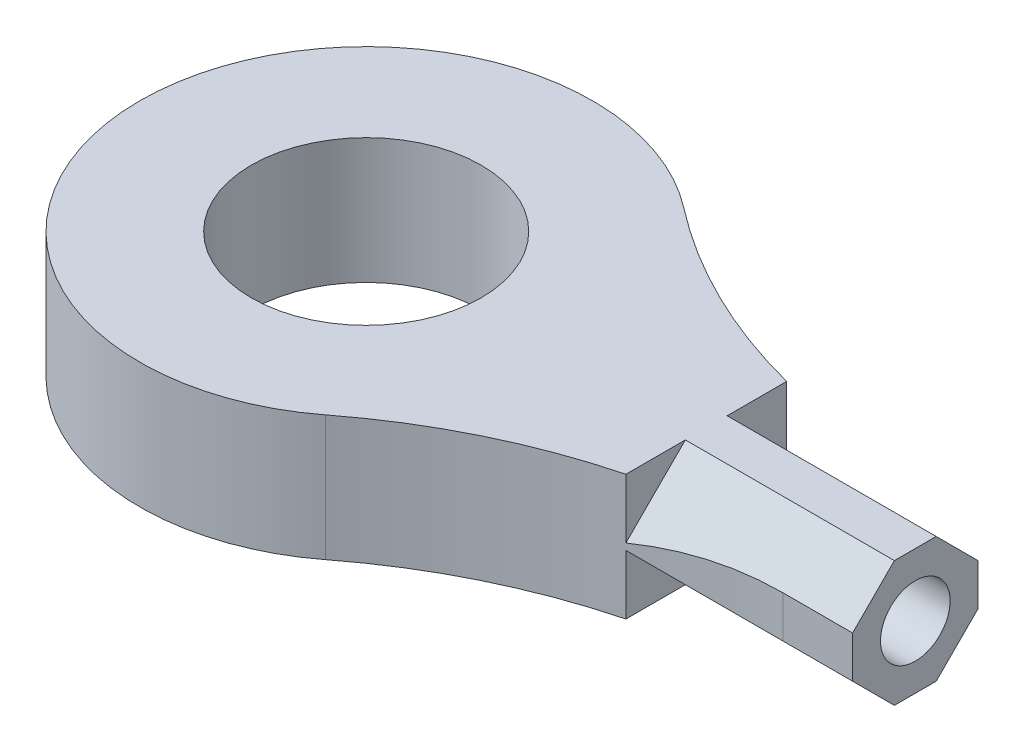
ISO-10303-21;
HEADER;
FILE_DESCRIPTION(('STEP AP214'),'2;1');
FILE_NAME('part.step','',(''),(''),'','','');
FILE_SCHEMA(('AUTOMOTIVE_DESIGN { 1 0 10303 214 1 1 1 1 }'));
ENDSEC;
DATA;
#1=APPLICATION_CONTEXT('core data for automotive mechanical design processes');
#2=APPLICATION_PROTOCOL_DEFINITION('international standard','automotive_design',2000,#1);
#3=PRODUCT_CONTEXT('',#1,'mechanical');
#4=PRODUCT('Part','Part','',(#3));
#5=PRODUCT_RELATED_PRODUCT_CATEGORY('part','',(#4));
#6=PRODUCT_DEFINITION_FORMATION('','',#4);
#7=PRODUCT_DEFINITION_CONTEXT('part definition',#1,'design');
#8=PRODUCT_DEFINITION('design','',#6,#7);
#9=PRODUCT_DEFINITION_SHAPE('','',#8);
#10=(LENGTH_UNIT() NAMED_UNIT(*) SI_UNIT(.MILLI.,.METRE.));
#11=(NAMED_UNIT(*) PLANE_ANGLE_UNIT() SI_UNIT($,.RADIAN.));
#12=(NAMED_UNIT(*) SI_UNIT($,.STERADIAN.) SOLID_ANGLE_UNIT());
#13=UNCERTAINTY_MEASURE_WITH_UNIT(LENGTH_MEASURE(1.E-05),#10,'distance_accuracy_value','');
#14=(GEOMETRIC_REPRESENTATION_CONTEXT(3) GLOBAL_UNCERTAINTY_ASSIGNED_CONTEXT((#13)) GLOBAL_UNIT_ASSIGNED_CONTEXT((#10,
#11,#12)) REPRESENTATION_CONTEXT('',''));
#15=CARTESIAN_POINT('',(0.,0.,0.));
#16=DIRECTION('',(0.,0.,1.));
#17=DIRECTION('',(1.,0.,0.));
#18=AXIS2_PLACEMENT_3D('',#15,#16,#17);
#19=CARTESIAN_POINT('',(34.4065764062628,9.,-44.5));
#20=DIRECTION('',(0.,1.,0.));
#21=DIRECTION('',(0.,0.,1.));
#22=AXIS2_PLACEMENT_3D('',#19,#20,#21);
#23=PLANE('',#22);
#24=DIRECTION('',(1.,0.,0.));
#25=VECTOR('',#24,1.);
#26=CARTESIAN_POINT('',(34.4065764062628,9.,-1.5));
#27=LINE('',#26,#25);
#28=CARTESIAN_POINT('',(24.4065764062628,9.,-1.5));
#29=VERTEX_POINT('',#28);
#30=CARTESIAN_POINT('',(39.4065764062628,9.,-1.5));
#31=VERTEX_POINT('',#30);
#32=EDGE_CURVE('E222',#29,#31,#27,.T.);
#33=ORIENTED_EDGE('',*,*,#32,.F.);
#34=DIRECTION('',(0.,0.,-1.));
#35=VECTOR('',#34,1.);
#36=CARTESIAN_POINT('',(24.4065764062628,9.,-44.5));
#37=LINE('',#36,#35);
#38=CARTESIAN_POINT('',(24.4065764062628,9.,-5.77016653792583));
#39=VERTEX_POINT('',#38);
#40=EDGE_CURVE('E210',#29,#39,#37,.T.);
#41=ORIENTED_EDGE('',*,*,#40,.T.);
#42=CARTESIAN_POINT('',(34.4065764062628,9.,-44.5));
#43=DIRECTION('',(0.,-1.,0.));
#44=DIRECTION('',(0.,0.,1.));
#45=AXIS2_PLACEMENT_3D('',#42,#43,#44);
#46=CIRCLE('',#45,40.);
#47=CARTESIAN_POINT('',(9.93967762847592,9.,-12.8555555555556));
#48=VERTEX_POINT('',#47);
#49=EDGE_CURVE('E219',#39,#48,#46,.T.);
#50=ORIENTED_EDGE('',*,*,#49,.T.);
#51=CARTESIAN_POINT('',(0.,9.,0.));
#52=DIRECTION('',(0.,1.,0.));
#53=DIRECTION('',(0.,0.,1.));
#54=AXIS2_PLACEMENT_3D('',#51,#52,#53);
#55=CIRCLE('',#54,16.25);
#56=CARTESIAN_POINT('',(9.93967762847592,9.,12.8555555555556));
#57=VERTEX_POINT('',#56);
#58=EDGE_CURVE('E226',#48,#57,#55,.T.);
#59=ORIENTED_EDGE('',*,*,#58,.T.);
#60=CARTESIAN_POINT('',(34.4065764062628,9.,44.5));
#61=DIRECTION('',(0.,-1.,0.));
#62=DIRECTION('',(0.,0.,-1.));
#63=AXIS2_PLACEMENT_3D('',#60,#61,#62);
#64=CIRCLE('',#63,40.);
#65=CARTESIAN_POINT('',(24.4065764062628,9.,5.77016653792583));
#66=VERTEX_POINT('',#65);
#67=EDGE_CURVE('E229',#57,#66,#64,.T.);
#68=ORIENTED_EDGE('',*,*,#67,.T.);
#69=DIRECTION('',(0.,0.,-1.));
#70=VECTOR('',#69,1.);
#71=CARTESIAN_POINT('',(24.4065764062628,9.,-44.5));
#72=LINE('',#71,#70);
#73=CARTESIAN_POINT('',(24.4065764062628,9.,1.5));
#74=VERTEX_POINT('',#73);
#75=EDGE_CURVE('E281',#66,#74,#72,.T.);
#76=ORIENTED_EDGE('',*,*,#75,.T.);
#77=DIRECTION('',(1.,0.,0.));
#78=VECTOR('',#77,1.);
#79=CARTESIAN_POINT('',(34.4065764062628,9.,1.49999999999999));
#80=LINE('',#79,#78);
#81=CARTESIAN_POINT('',(39.4065764062628,9.,1.5));
#82=VERTEX_POINT('',#81);
#83=EDGE_CURVE('E278',#74,#82,#80,.T.);
#84=ORIENTED_EDGE('',*,*,#83,.T.);
#85=DIRECTION('',(0.,0.,-1.));
#86=VECTOR('',#85,1.);
#87=CARTESIAN_POINT('',(39.4065764062628,9.,-4.5));
#88=LINE('',#87,#86);
#89=EDGE_CURVE('E239',#82,#31,#88,.T.);
#90=ORIENTED_EDGE('',*,*,#89,.T.);
#91=EDGE_LOOP('',(#33,#41,#50,#59,#68,#76,#84,#90));
#92=FACE_BOUND('',#91,.T.);
#93=CARTESIAN_POINT('',(0.,9.,0.));
#94=DIRECTION('',(0.,1.,0.));
#95=DIRECTION('',(0.,0.,1.));
#96=AXIS2_PLACEMENT_3D('',#93,#94,#95);
#97=CIRCLE('',#96,8.25);
#98=CARTESIAN_POINT('',(0.,9.,8.25));
#99=VERTEX_POINT('',#98);
#100=EDGE_CURVE('E244',#99,#99,#97,.T.);
#101=ORIENTED_EDGE('',*,*,#100,.F.);
#102=EDGE_LOOP('',(#101));
#103=FACE_BOUND('',#102,.T.);
#104=ADVANCED_FACE('F58',(#92,#103),#23,.T.);
#105=CARTESIAN_POINT('',(34.4065764062628,0.,-44.5));
#106=DIRECTION('',(0.,1.,0.));
#107=DIRECTION('',(0.,0.,1.));
#108=AXIS2_PLACEMENT_3D('',#105,#106,#107);
#109=PLANE('',#108);
#110=CARTESIAN_POINT('',(0.,0.,0.));
#111=DIRECTION('',(0.,1.,0.));
#112=DIRECTION('',(0.,0.,1.));
#113=AXIS2_PLACEMENT_3D('',#110,#111,#112);
#114=CIRCLE('',#113,8.25);
#115=CARTESIAN_POINT('',(0.,0.,8.25));
#116=VERTEX_POINT('',#115);
#117=EDGE_CURVE('E234',#116,#116,#114,.T.);
#118=ORIENTED_EDGE('',*,*,#117,.T.);
#119=EDGE_LOOP('',(#118));
#120=FACE_BOUND('',#119,.T.);
#121=DIRECTION('',(0.,0.,-1.));
#122=VECTOR('',#121,1.);
#123=CARTESIAN_POINT('',(39.4065764062628,0.,-4.5));
#124=LINE('',#123,#122);
#125=CARTESIAN_POINT('',(39.4065764062628,0.,1.5));
#126=VERTEX_POINT('',#125);
#127=CARTESIAN_POINT('',(39.4065764062628,0.,-1.5));
#128=VERTEX_POINT('',#127);
#129=EDGE_CURVE('E227',#126,#128,#124,.T.);
#130=ORIENTED_EDGE('',*,*,#129,.F.);
#131=DIRECTION('',(-1.,0.,0.));
#132=VECTOR('',#131,1.);
#133=CARTESIAN_POINT('',(34.4065764062628,0.,1.5));
#134=LINE('',#133,#132);
#135=CARTESIAN_POINT('',(24.4065764062628,0.,1.5));
#136=VERTEX_POINT('',#135);
#137=EDGE_CURVE('E73',#126,#136,#134,.T.);
#138=ORIENTED_EDGE('',*,*,#137,.T.);
#139=DIRECTION('',(0.,0.,-1.));
#140=VECTOR('',#139,1.);
#141=CARTESIAN_POINT('',(24.4065764062628,0.,-44.5));
#142=LINE('',#141,#140);
#143=CARTESIAN_POINT('',(24.4065764062628,0.,5.77016653792583));
#144=VERTEX_POINT('',#143);
#145=EDGE_CURVE('E339',#144,#136,#142,.T.);
#146=ORIENTED_EDGE('',*,*,#145,.F.);
#147=CARTESIAN_POINT('',(34.4065764062628,0.,44.5));
#148=DIRECTION('',(0.,-1.,0.));
#149=DIRECTION('',(0.,0.,-1.));
#150=AXIS2_PLACEMENT_3D('',#147,#148,#149);
#151=CIRCLE('',#150,40.);
#152=CARTESIAN_POINT('',(9.93967762847592,0.,12.8555555555556));
#153=VERTEX_POINT('',#152);
#154=EDGE_CURVE('E231',#153,#144,#151,.T.);
#155=ORIENTED_EDGE('',*,*,#154,.F.);
#156=CARTESIAN_POINT('',(0.,0.,0.));
#157=DIRECTION('',(0.,1.,0.));
#158=DIRECTION('',(0.,0.,1.));
#159=AXIS2_PLACEMENT_3D('',#156,#157,#158);
#160=CIRCLE('',#159,16.25);
#161=CARTESIAN_POINT('',(9.93967762847592,0.,-12.8555555555556));
#162=VERTEX_POINT('',#161);
#163=EDGE_CURVE('E243',#162,#153,#160,.T.);
#164=ORIENTED_EDGE('',*,*,#163,.F.);
#165=CARTESIAN_POINT('',(34.4065764062628,0.,-44.5));
#166=DIRECTION('',(0.,-1.,0.));
#167=DIRECTION('',(0.,0.,1.));
#168=AXIS2_PLACEMENT_3D('',#165,#166,#167);
#169=CIRCLE('',#168,40.);
#170=CARTESIAN_POINT('',(24.4065764062628,0.,-5.77016653792583));
#171=VERTEX_POINT('',#170);
#172=EDGE_CURVE('E241',#171,#162,#169,.T.);
#173=ORIENTED_EDGE('',*,*,#172,.F.);
#174=DIRECTION('',(0.,0.,-1.));
#175=VECTOR('',#174,1.);
#176=CARTESIAN_POINT('',(24.4065764062628,0.,-44.5));
#177=LINE('',#176,#175);
#178=CARTESIAN_POINT('',(24.4065764062628,0.,-1.5));
#179=VERTEX_POINT('',#178);
#180=EDGE_CURVE('E284',#179,#171,#177,.T.);
#181=ORIENTED_EDGE('',*,*,#180,.F.);
#182=DIRECTION('',(-1.,0.,0.));
#183=VECTOR('',#182,1.);
#184=CARTESIAN_POINT('',(34.4065764062628,0.,-1.5));
#185=LINE('',#184,#183);
#186=EDGE_CURVE('E262',#128,#179,#185,.T.);
#187=ORIENTED_EDGE('',*,*,#186,.F.);
#188=EDGE_LOOP('',(#130,#138,#146,#155,#164,#173,#181,#187));
#189=FACE_BOUND('',#188,.T.);
#190=ADVANCED_FACE('F297',(#120,#189),#109,.F.);
#191=CARTESIAN_POINT('',(34.4065764062628,9.,-44.5));
#192=DIRECTION('',(0.,-1.,0.));
#193=DIRECTION('',(0.,0.,-1.));
#194=AXIS2_PLACEMENT_3D('',#191,#192,#193);
#195=CYLINDRICAL_SURFACE('',#194,40.);
#196=DIRECTION('',(0.,-1.,0.));
#197=VECTOR('',#196,1.);
#198=CARTESIAN_POINT('',(24.4065764062628,9.,-5.77016653792583));
#199=LINE('',#198,#197);
#200=CARTESIAN_POINT('',(24.4065764062628,4.72983346207417,-5.77016653792583));
#201=VERTEX_POINT('',#200);
#202=EDGE_CURVE('E166',#201,#39,#199,.F.);
#203=ORIENTED_EDGE('',*,*,#202,.F.);
#204=CARTESIAN_POINT('',(34.4065764062628,-34.,-44.5));
#205=DIRECTION('',(0.,-0.707106781186548,0.707106781186547));
#206=DIRECTION('',(0.,-0.707106781186547,-0.707106781186548));
#207=AXIS2_PLACEMENT_3D('',#204,#205,#206);
#208=ELLIPSE('',#207,56.5685424949238,40.);
#209=CARTESIAN_POINT('',(34.4065764062628,6.,-4.5));
#210=VERTEX_POINT('',#209);
#211=EDGE_CURVE('E252',#201,#210,#208,.F.);
#212=ORIENTED_EDGE('',*,*,#211,.T.);
#213=DIRECTION('',(0.,-1.,0.));
#214=VECTOR('',#213,1.);
#215=CARTESIAN_POINT('',(34.4065764062628,9.,-4.5));
#216=LINE('',#215,#214);
#217=CARTESIAN_POINT('',(34.4065764062628,3.,-4.5));
#218=VERTEX_POINT('',#217);
#219=EDGE_CURVE('E186',#210,#218,#216,.T.);
#220=ORIENTED_EDGE('',*,*,#219,.T.);
#221=CARTESIAN_POINT('',(34.4065764062628,43.,-44.5));
#222=DIRECTION('',(0.,-0.707106781186547,-0.707106781186547));
#223=DIRECTION('',(0.,-0.707106781186548,0.707106781186548));
#224=AXIS2_PLACEMENT_3D('',#221,#222,#223);
#225=ELLIPSE('',#224,56.5685424949238,40.);
#226=CARTESIAN_POINT('',(24.4065764062628,4.27016653792583,-5.77016653792583));
#227=VERTEX_POINT('',#226);
#228=EDGE_CURVE('E251',#227,#218,#225,.F.);
#229=ORIENTED_EDGE('',*,*,#228,.F.);
#230=DIRECTION('',(0.,-1.,0.));
#231=VECTOR('',#230,1.);
#232=CARTESIAN_POINT('',(24.4065764062628,9.,-5.77016653792583));
#233=LINE('',#232,#231);
#234=EDGE_CURVE('E201',#171,#227,#233,.F.);
#235=ORIENTED_EDGE('',*,*,#234,.F.);
#236=ORIENTED_EDGE('',*,*,#172,.T.);
#237=DIRECTION('',(0.,-1.,0.));
#238=VECTOR('',#237,1.);
#239=CARTESIAN_POINT('',(9.93967762847592,9.,-12.8555555555556));
#240=LINE('',#239,#238);
#241=EDGE_CURVE('E192',#48,#162,#240,.T.);
#242=ORIENTED_EDGE('',*,*,#241,.F.);
#243=ORIENTED_EDGE('',*,*,#49,.F.);
#244=EDGE_LOOP('',(#203,#212,#220,#229,#235,#236,#242,#243));
#245=FACE_BOUND('',#244,.T.);
#246=ADVANCED_FACE('F60',(#245),#195,.F.);
#247=CARTESIAN_POINT('',(34.4065764062628,9.,44.5));
#248=DIRECTION('',(0.,-1.,0.));
#249=DIRECTION('',(0.,0.,-1.));
#250=AXIS2_PLACEMENT_3D('',#247,#248,#249);
#251=CYLINDRICAL_SURFACE('',#250,40.);
#252=DIRECTION('',(0.,-1.,0.));
#253=VECTOR('',#252,1.);
#254=CARTESIAN_POINT('',(24.4065764062628,9.,5.77016653792583));
#255=LINE('',#254,#253);
#256=CARTESIAN_POINT('',(24.4065764062628,4.27016653792583,5.77016653792583));
#257=VERTEX_POINT('',#256);
#258=EDGE_CURVE('E12',#257,#144,#255,.T.);
#259=ORIENTED_EDGE('',*,*,#258,.F.);
#260=CARTESIAN_POINT('',(34.4065764062628,43.,44.5));
#261=DIRECTION('',(0.,0.707106781186547,-0.707106781186547));
#262=DIRECTION('',(0.,-0.707106781186548,-0.707106781186548));
#263=AXIS2_PLACEMENT_3D('',#260,#261,#262);
#264=ELLIPSE('',#263,56.5685424949238,40.);
#265=CARTESIAN_POINT('',(34.4065764062628,3.,4.5));
#266=VERTEX_POINT('',#265);
#267=EDGE_CURVE('E175',#257,#266,#264,.F.);
#268=ORIENTED_EDGE('',*,*,#267,.T.);
#269=DIRECTION('',(0.,-1.,0.));
#270=VECTOR('',#269,1.);
#271=CARTESIAN_POINT('',(34.4065764062628,9.,4.5));
#272=LINE('',#271,#270);
#273=CARTESIAN_POINT('',(34.4065764062628,6.,4.5));
#274=VERTEX_POINT('',#273);
#275=EDGE_CURVE('E174',#274,#266,#272,.T.);
#276=ORIENTED_EDGE('',*,*,#275,.F.);
#277=CARTESIAN_POINT('',(34.4065764062628,-34.,44.5));
#278=DIRECTION('',(0.,0.707106781186548,0.707106781186547));
#279=DIRECTION('',(0.,-0.707106781186547,0.707106781186548));
#280=AXIS2_PLACEMENT_3D('',#277,#278,#279);
#281=ELLIPSE('',#280,56.5685424949238,40.);
#282=CARTESIAN_POINT('',(24.4065764062628,4.72983346207417,5.77016653792583));
#283=VERTEX_POINT('',#282);
#284=EDGE_CURVE('E276',#283,#274,#281,.F.);
#285=ORIENTED_EDGE('',*,*,#284,.F.);
#286=DIRECTION('',(0.,-1.,0.));
#287=VECTOR('',#286,1.);
#288=CARTESIAN_POINT('',(24.4065764062628,9.,5.77016653792583));
#289=LINE('',#288,#287);
#290=EDGE_CURVE('E199',#66,#283,#289,.T.);
#291=ORIENTED_EDGE('',*,*,#290,.F.);
#292=ORIENTED_EDGE('',*,*,#67,.F.);
#293=DIRECTION('',(0.,-1.,0.));
#294=VECTOR('',#293,1.);
#295=CARTESIAN_POINT('',(9.93967762847592,9.,12.8555555555556));
#296=LINE('',#295,#294);
#297=EDGE_CURVE('E184',#57,#153,#296,.T.);
#298=ORIENTED_EDGE('',*,*,#297,.T.);
#299=ORIENTED_EDGE('',*,*,#154,.T.);
#300=EDGE_LOOP('',(#259,#268,#276,#285,#291,#292,#298,#299));
#301=FACE_BOUND('',#300,.T.);
#302=ADVANCED_FACE('F327',(#301),#251,.F.);
#303=CARTESIAN_POINT('',(39.4065764062628,9.,4.5));
#304=DIRECTION('',(0.,0.,-1.));
#305=DIRECTION('',(-1.,0.,0.));
#306=AXIS2_PLACEMENT_3D('',#303,#304,#305);
#307=PLANE('',#306);
#308=ORIENTED_EDGE('',*,*,#275,.T.);
#309=DIRECTION('',(1.,0.,0.));
#310=VECTOR('',#309,1.);
#311=CARTESIAN_POINT('',(39.4065764062628,3.,4.5));
#312=LINE('',#311,#310);
#313=CARTESIAN_POINT('',(39.4065764062628,3.,4.5));
#314=VERTEX_POINT('',#313);
#315=EDGE_CURVE('E161',#266,#314,#312,.T.);
#316=ORIENTED_EDGE('',*,*,#315,.T.);
#317=DIRECTION('',(0.,-1.,0.));
#318=VECTOR('',#317,1.);
#319=CARTESIAN_POINT('',(39.4065764062628,9.,4.5));
#320=LINE('',#319,#318);
#321=CARTESIAN_POINT('',(39.4065764062628,6.,4.5));
#322=VERTEX_POINT('',#321);
#323=EDGE_CURVE('E172',#322,#314,#320,.T.);
#324=ORIENTED_EDGE('',*,*,#323,.F.);
#325=DIRECTION('',(1.,0.,0.));
#326=VECTOR('',#325,1.);
#327=CARTESIAN_POINT('',(39.4065764062628,6.,4.5));
#328=LINE('',#327,#326);
#329=EDGE_CURVE('E274',#274,#322,#328,.T.);
#330=ORIENTED_EDGE('',*,*,#329,.F.);
#331=EDGE_LOOP('',(#308,#316,#324,#330));
#332=FACE_BOUND('',#331,.T.);
#333=ADVANCED_FACE('F170',(#332),#307,.F.);
#334=CARTESIAN_POINT('',(39.4065764062628,9.,-4.5));
#335=DIRECTION('',(-1.,0.,0.));
#336=DIRECTION('',(0.,0.,1.));
#337=AXIS2_PLACEMENT_3D('',#334,#335,#336);
#338=PLANE('',#337);
#339=CARTESIAN_POINT('',(39.4065764062628,4.5,0.));
#340=DIRECTION('',(1.,0.,0.));
#341=DIRECTION('',(0.,0.,-1.));
#342=AXIS2_PLACEMENT_3D('',#339,#340,#341);
#343=CIRCLE('',#342,2.49999999999999);
#344=CARTESIAN_POINT('',(39.4065764062628,4.5,-2.49999999999999));
#345=VERTEX_POINT('',#344);
#346=EDGE_CURVE('E286',#345,#345,#343,.T.);
#347=ORIENTED_EDGE('',*,*,#346,.F.);
#348=EDGE_LOOP('',(#347));
#349=FACE_BOUND('',#348,.T.);
#350=ORIENTED_EDGE('',*,*,#323,.T.);
#351=DIRECTION('',(0.,-0.707106781186548,-0.707106781186548));
#352=VECTOR('',#351,1.);
#353=CARTESIAN_POINT('',(39.4065764062628,1.5,3.));
#354=LINE('',#353,#352);
#355=EDGE_CURVE('E66',#314,#126,#354,.T.);
#356=ORIENTED_EDGE('',*,*,#355,.T.);
#357=ORIENTED_EDGE('',*,*,#129,.T.);
#358=DIRECTION('',(0.,0.707106781186548,-0.707106781186548));
#359=VECTOR('',#358,1.);
#360=CARTESIAN_POINT('',(39.4065764062628,-0.75,-0.75));
#361=LINE('',#360,#359);
#362=CARTESIAN_POINT('',(39.4065764062628,3.,-4.5));
#363=VERTEX_POINT('',#362);
#364=EDGE_CURVE('E223',#128,#363,#361,.T.);
#365=ORIENTED_EDGE('',*,*,#364,.T.);
#366=DIRECTION('',(0.,-1.,0.));
#367=VECTOR('',#366,1.);
#368=CARTESIAN_POINT('',(39.4065764062628,9.,-4.5));
#369=LINE('',#368,#367);
#370=CARTESIAN_POINT('',(39.4065764062628,6.,-4.5));
#371=VERTEX_POINT('',#370);
#372=EDGE_CURVE('E182',#371,#363,#369,.T.);
#373=ORIENTED_EDGE('',*,*,#372,.F.);
#374=DIRECTION('',(0.,-0.707106781186547,-0.707106781186548));
#375=VECTOR('',#374,1.);
#376=CARTESIAN_POINT('',(39.4065764062628,5.25,-5.25));
#377=LINE('',#376,#375);
#378=EDGE_CURVE('E81',#31,#371,#377,.T.);
#379=ORIENTED_EDGE('',*,*,#378,.F.);
#380=ORIENTED_EDGE('',*,*,#89,.F.);
#381=DIRECTION('',(0.,0.707106781186547,-0.707106781186548));
#382=VECTOR('',#381,1.);
#383=CARTESIAN_POINT('',(39.4065764062628,12.,-1.5));
#384=LINE('',#383,#382);
#385=EDGE_CURVE('E181',#322,#82,#384,.T.);
#386=ORIENTED_EDGE('',*,*,#385,.F.);
#387=EDGE_LOOP('',(#350,#356,#357,#365,#373,#379,#380,#386));
#388=FACE_BOUND('',#387,.T.);
#389=ADVANCED_FACE('F179',(#349,#388),#338,.F.);
#390=CARTESIAN_POINT('',(39.4065764062628,9.,-4.5));
#391=DIRECTION('',(0.,0.,1.));
#392=DIRECTION('',(1.,0.,0.));
#393=AXIS2_PLACEMENT_3D('',#390,#391,#392);
#394=PLANE('',#393);
#395=ORIENTED_EDGE('',*,*,#219,.F.);
#396=DIRECTION('',(1.,0.,0.));
#397=VECTOR('',#396,1.);
#398=CARTESIAN_POINT('',(39.4065764062628,6.,-4.5));
#399=LINE('',#398,#397);
#400=EDGE_CURVE('E203',#210,#371,#399,.T.);
#401=ORIENTED_EDGE('',*,*,#400,.T.);
#402=ORIENTED_EDGE('',*,*,#372,.T.);
#403=DIRECTION('',(1.,0.,0.));
#404=VECTOR('',#403,1.);
#405=CARTESIAN_POINT('',(39.4065764062628,3.,-4.5));
#406=LINE('',#405,#404);
#407=EDGE_CURVE('E195',#218,#363,#406,.T.);
#408=ORIENTED_EDGE('',*,*,#407,.F.);
#409=EDGE_LOOP('',(#395,#401,#402,#408));
#410=FACE_BOUND('',#409,.T.);
#411=ADVANCED_FACE('F265',(#410),#394,.F.);
#412=CARTESIAN_POINT('',(0.,9.,0.));
#413=DIRECTION('',(0.,-1.,0.));
#414=DIRECTION('',(0.,0.,-1.));
#415=AXIS2_PLACEMENT_3D('',#412,#413,#414);
#416=CYLINDRICAL_SURFACE('',#415,16.25);
#417=ORIENTED_EDGE('',*,*,#163,.T.);
#418=ORIENTED_EDGE('',*,*,#297,.F.);
#419=ORIENTED_EDGE('',*,*,#58,.F.);
#420=ORIENTED_EDGE('',*,*,#241,.T.);
#421=EDGE_LOOP('',(#417,#418,#419,#420));
#422=FACE_BOUND('',#421,.T.);
#423=ADVANCED_FACE('F303',(#422),#416,.T.);
#424=CARTESIAN_POINT('',(0.,9.,0.));
#425=DIRECTION('',(0.,-1.,0.));
#426=DIRECTION('',(0.,0.,-1.));
#427=AXIS2_PLACEMENT_3D('',#424,#425,#426);
#428=CYLINDRICAL_SURFACE('',#427,8.25);
#429=ORIENTED_EDGE('',*,*,#100,.T.);
#430=EDGE_LOOP('',(#429));
#431=FACE_BOUND('',#430,.T.);
#432=ORIENTED_EDGE('',*,*,#117,.F.);
#433=EDGE_LOOP('',(#432));
#434=FACE_BOUND('',#433,.T.);
#435=ADVANCED_FACE('F300',(#431,#434),#428,.F.);
#436=CARTESIAN_POINT('',(24.4065764062628,4.5,0.));
#437=DIRECTION('',(1.,0.,0.));
#438=DIRECTION('',(0.,0.,-1.));
#439=AXIS2_PLACEMENT_3D('',#436,#437,#438);
#440=CONICAL_SURFACE('',#439,2.5,1.02974425867665);
#441=CARTESIAN_POINT('',(22.9044248586939,4.5,0.));
#442=VERTEX_POINT('',#441);
#443=VERTEX_LOOP('',#442);
#444=FACE_BOUND('',#443,.T.);
#445=CARTESIAN_POINT('',(24.4065764062628,4.5,0.));
#446=DIRECTION('',(1.,0.,0.));
#447=DIRECTION('',(0.,0.,-1.));
#448=AXIS2_PLACEMENT_3D('',#445,#446,#447);
#449=CIRCLE('',#448,2.5);
#450=CARTESIAN_POINT('',(24.4065764062628,4.5,-2.5));
#451=VERTEX_POINT('',#450);
#452=EDGE_CURVE('E289',#451,#451,#449,.T.);
#453=ORIENTED_EDGE('',*,*,#452,.T.);
#454=EDGE_LOOP('',(#453));
#455=FACE_BOUND('',#454,.T.);
#456=ADVANCED_FACE('F302',(#444,#455),#440,.F.);
#457=CARTESIAN_POINT('',(39.4065764062628,4.5,0.));
#458=DIRECTION('',(1.,0.,0.));
#459=DIRECTION('',(0.,0.,-1.));
#460=AXIS2_PLACEMENT_3D('',#457,#458,#459);
#461=CYLINDRICAL_SURFACE('',#460,2.49999999999999);
#462=ORIENTED_EDGE('',*,*,#452,.F.);
#463=EDGE_LOOP('',(#462));
#464=FACE_BOUND('',#463,.T.);
#465=ORIENTED_EDGE('',*,*,#346,.T.);
#466=EDGE_LOOP('',(#465));
#467=FACE_BOUND('',#466,.T.);
#468=ADVANCED_FACE('F309',(#464,#467),#461,.F.);
#469=CARTESIAN_POINT('',(24.4065764062628,0.,0.));
#470=DIRECTION('',(1.,0.,0.));
#471=DIRECTION('',(0.,0.,-1.));
#472=AXIS2_PLACEMENT_3D('',#469,#470,#471);
#473=PLANE('',#472);
#474=ORIENTED_EDGE('',*,*,#180,.T.);
#475=ORIENTED_EDGE('',*,*,#234,.T.);
#476=DIRECTION('',(0.,0.707106781186548,-0.707106781186548));
#477=VECTOR('',#476,1.);
#478=CARTESIAN_POINT('',(24.4065764062628,-0.75,-0.75));
#479=LINE('',#478,#477);
#480=EDGE_CURVE('E261',#179,#227,#479,.T.);
#481=ORIENTED_EDGE('',*,*,#480,.F.);
#482=EDGE_LOOP('',(#474,#475,#481));
#483=FACE_BOUND('',#482,.T.);
#484=ADVANCED_FACE('F362',(#483),#473,.T.);
#485=CARTESIAN_POINT('',(24.4065764062628,-0.75,-0.75));
#486=DIRECTION('',(0.,-0.707106781186547,-0.707106781186547));
#487=DIRECTION('',(0.,0.707106781186548,-0.707106781186548));
#488=AXIS2_PLACEMENT_3D('',#485,#486,#487);
#489=PLANE('',#488);
#490=ORIENTED_EDGE('',*,*,#186,.T.);
#491=ORIENTED_EDGE('',*,*,#480,.T.);
#492=ORIENTED_EDGE('',*,*,#228,.T.);
#493=ORIENTED_EDGE('',*,*,#407,.T.);
#494=ORIENTED_EDGE('',*,*,#364,.F.);
#495=EDGE_LOOP('',(#490,#491,#492,#493,#494));
#496=FACE_BOUND('',#495,.T.);
#497=ADVANCED_FACE('F257',(#496),#489,.T.);
#498=CARTESIAN_POINT('',(24.4065764062628,5.25,5.25));
#499=DIRECTION('',(0.,0.707106781186548,0.707106781186547));
#500=DIRECTION('',(0.,-0.707106781186547,0.707106781186548));
#501=AXIS2_PLACEMENT_3D('',#498,#499,#500);
#502=PLANE('',#501);
#503=DIRECTION('',(0.,-0.707106781186547,0.707106781186548));
#504=VECTOR('',#503,1.);
#505=CARTESIAN_POINT('',(24.4065764062628,5.25,5.25));
#506=LINE('',#505,#504);
#507=EDGE_CURVE('E263',#74,#283,#506,.T.);
#508=ORIENTED_EDGE('',*,*,#507,.T.);
#509=ORIENTED_EDGE('',*,*,#284,.T.);
#510=ORIENTED_EDGE('',*,*,#329,.T.);
#511=ORIENTED_EDGE('',*,*,#385,.T.);
#512=ORIENTED_EDGE('',*,*,#83,.F.);
#513=EDGE_LOOP('',(#508,#509,#510,#511,#512));
#514=FACE_BOUND('',#513,.T.);
#515=ADVANCED_FACE('F357',(#514),#502,.T.);
#516=CARTESIAN_POINT('',(24.4065764062628,0.,0.));
#517=DIRECTION('',(1.,0.,0.));
#518=DIRECTION('',(0.,0.,-1.));
#519=AXIS2_PLACEMENT_3D('',#516,#517,#518);
#520=PLANE('',#519);
#521=ORIENTED_EDGE('',*,*,#290,.T.);
#522=ORIENTED_EDGE('',*,*,#507,.F.);
#523=ORIENTED_EDGE('',*,*,#75,.F.);
#524=EDGE_LOOP('',(#521,#522,#523));
#525=FACE_BOUND('',#524,.T.);
#526=ADVANCED_FACE('F350',(#525),#520,.T.);
#527=CARTESIAN_POINT('',(24.4065764062628,5.25,-5.25));
#528=DIRECTION('',(0.,-0.707106781186548,0.707106781186547));
#529=DIRECTION('',(0.,-0.707106781186547,-0.707106781186548));
#530=AXIS2_PLACEMENT_3D('',#527,#528,#529);
#531=PLANE('',#530);
#532=ORIENTED_EDGE('',*,*,#32,.T.);
#533=ORIENTED_EDGE('',*,*,#378,.T.);
#534=ORIENTED_EDGE('',*,*,#400,.F.);
#535=ORIENTED_EDGE('',*,*,#211,.F.);
#536=DIRECTION('',(0.,-0.707106781186547,-0.707106781186548));
#537=VECTOR('',#536,1.);
#538=CARTESIAN_POINT('',(24.4065764062628,5.25,-5.25));
#539=LINE('',#538,#537);
#540=EDGE_CURVE('E212',#29,#201,#539,.T.);
#541=ORIENTED_EDGE('',*,*,#540,.F.);
#542=EDGE_LOOP('',(#532,#533,#534,#535,#541));
#543=FACE_BOUND('',#542,.T.);
#544=ADVANCED_FACE('F348',(#543),#531,.F.);
#545=CARTESIAN_POINT('',(24.4065764062628,0.,0.));
#546=DIRECTION('',(1.,0.,0.));
#547=DIRECTION('',(0.,0.,-1.));
#548=AXIS2_PLACEMENT_3D('',#545,#546,#547);
#549=PLANE('',#548);
#550=ORIENTED_EDGE('',*,*,#540,.T.);
#551=ORIENTED_EDGE('',*,*,#202,.T.);
#552=ORIENTED_EDGE('',*,*,#40,.F.);
#553=EDGE_LOOP('',(#550,#551,#552));
#554=FACE_BOUND('',#553,.T.);
#555=ADVANCED_FACE('F209',(#554),#549,.T.);
#556=CARTESIAN_POINT('',(24.4065764062628,0.,0.));
#557=DIRECTION('',(1.,0.,0.));
#558=DIRECTION('',(0.,0.,-1.));
#559=AXIS2_PLACEMENT_3D('',#556,#557,#558);
#560=PLANE('',#559);
#561=ORIENTED_EDGE('',*,*,#145,.T.);
#562=DIRECTION('',(0.,0.707106781186548,0.707106781186548));
#563=VECTOR('',#562,1.);
#564=CARTESIAN_POINT('',(24.4065764062628,-0.75,0.75));
#565=LINE('',#564,#563);
#566=EDGE_CURVE('E176',#136,#257,#565,.T.);
#567=ORIENTED_EDGE('',*,*,#566,.T.);
#568=ORIENTED_EDGE('',*,*,#258,.T.);
#569=EDGE_LOOP('',(#561,#567,#568));
#570=FACE_BOUND('',#569,.T.);
#571=ADVANCED_FACE('F338',(#570),#560,.T.);
#572=CARTESIAN_POINT('',(24.4065764062628,-0.75,0.75));
#573=DIRECTION('',(0.,0.707106781186547,-0.707106781186547));
#574=DIRECTION('',(0.,0.707106781186548,0.707106781186548));
#575=AXIS2_PLACEMENT_3D('',#572,#573,#574);
#576=PLANE('',#575);
#577=ORIENTED_EDGE('',*,*,#355,.F.);
#578=ORIENTED_EDGE('',*,*,#315,.F.);
#579=ORIENTED_EDGE('',*,*,#267,.F.);
#580=ORIENTED_EDGE('',*,*,#566,.F.);
#581=ORIENTED_EDGE('',*,*,#137,.F.);
#582=EDGE_LOOP('',(#577,#578,#579,#580,#581));
#583=FACE_BOUND('',#582,.T.);
#584=ADVANCED_FACE('F160',(#583),#576,.F.);
#585=CLOSED_SHELL('',(#104,#190,#246,#302,#333,#389,#411,#423,#435,#456,#468,#484,#497,#515,
#526,#544,#555,#571,#584));
#586=MANIFOLD_SOLID_BREP('B2',#585);
#587=ADVANCED_BREP_SHAPE_REPRESENTATION('',(#18,#586),#14);
#588=SHAPE_DEFINITION_REPRESENTATION(#9,#587);
ENDSEC;
END-ISO-10303-21;
